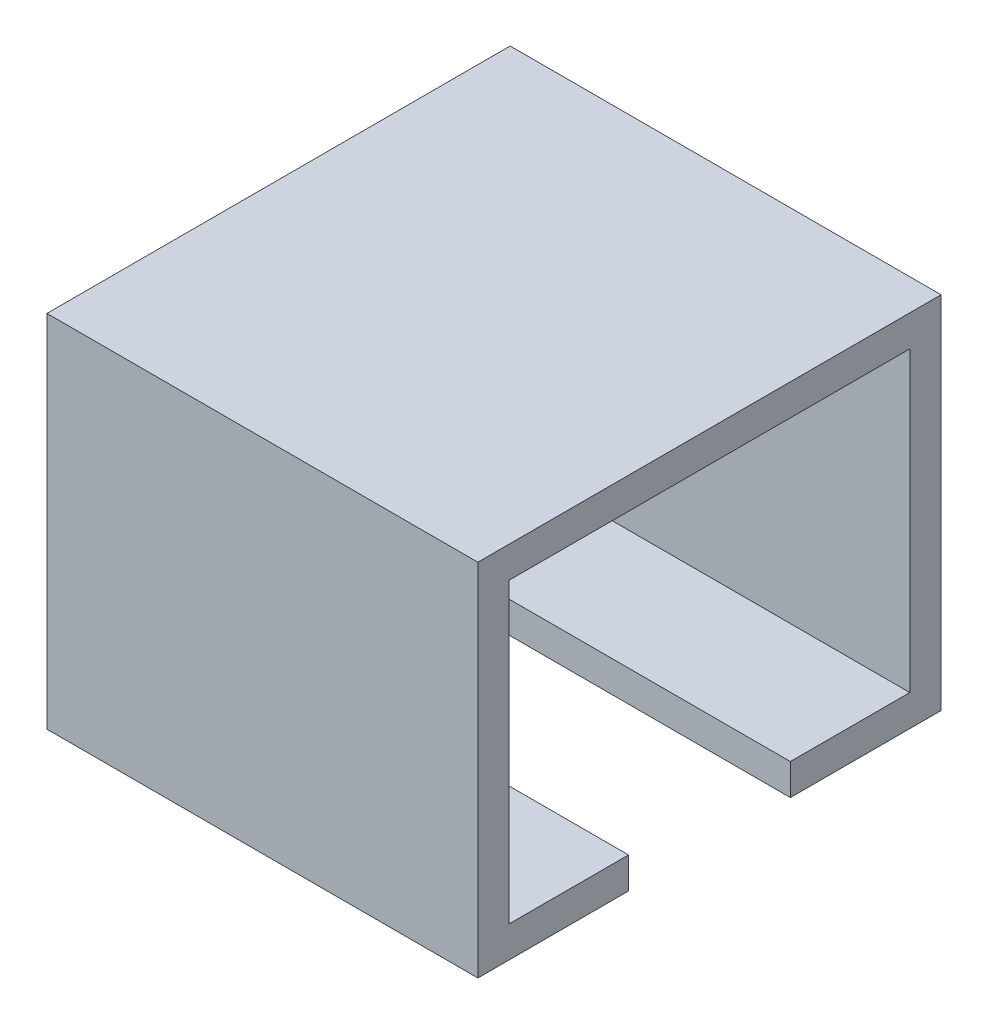
ISO-10303-21;
HEADER;
FILE_DESCRIPTION(('STEP AP214'),'2;1');
FILE_NAME('part.step','',(''),(''),'','','');
FILE_SCHEMA(('AUTOMOTIVE_DESIGN { 1 0 10303 214 1 1 1 1 }'));
ENDSEC;
DATA;
#1=APPLICATION_CONTEXT('core data for automotive mechanical design processes');
#2=APPLICATION_PROTOCOL_DEFINITION('international standard','automotive_design',2000,#1);
#3=PRODUCT_CONTEXT('',#1,'mechanical');
#4=PRODUCT('Part','Part','',(#3));
#5=PRODUCT_RELATED_PRODUCT_CATEGORY('part','',(#4));
#6=PRODUCT_DEFINITION_FORMATION('','',#4);
#7=PRODUCT_DEFINITION_CONTEXT('part definition',#1,'design');
#8=PRODUCT_DEFINITION('design','',#6,#7);
#9=PRODUCT_DEFINITION_SHAPE('','',#8);
#10=(LENGTH_UNIT() NAMED_UNIT(*) SI_UNIT(.MILLI.,.METRE.));
#11=(NAMED_UNIT(*) PLANE_ANGLE_UNIT() SI_UNIT($,.RADIAN.));
#12=(NAMED_UNIT(*) SI_UNIT($,.STERADIAN.) SOLID_ANGLE_UNIT());
#13=UNCERTAINTY_MEASURE_WITH_UNIT(LENGTH_MEASURE(1.E-05),#10,'distance_accuracy_value','');
#14=(GEOMETRIC_REPRESENTATION_CONTEXT(3) GLOBAL_UNCERTAINTY_ASSIGNED_CONTEXT((#13)) GLOBAL_UNIT_ASSIGNED_CONTEXT((#10,
#11,#12)) REPRESENTATION_CONTEXT('',''));
#15=CARTESIAN_POINT('',(0.,0.,0.));
#16=DIRECTION('',(0.,0.,1.));
#17=DIRECTION('',(1.,0.,0.));
#18=AXIS2_PLACEMENT_3D('',#15,#16,#17);
#19=CARTESIAN_POINT('',(0.0999999999998588,74.5297165423406,77.3109125997443));
#20=DIRECTION('',(1.,0.,0.));
#21=DIRECTION('',(0.,1.,0.));
#22=AXIS2_PLACEMENT_3D('',#19,#20,#21);
#23=PLANE('',#22);
#24=DIRECTION('',(0.,0.,-1.));
#25=VECTOR('',#24,1.);
#26=CARTESIAN_POINT('',(0.0999999999998588,74.2503165423406,81.0193125997443));
#27=LINE('',#26,#25);
#28=CARTESIAN_POINT('',(0.0999999999998588,74.2503165423406,81.0193125997443));
#29=VERTEX_POINT('',#28);
#30=CARTESIAN_POINT('',(0.099999999999861,74.2503165423406,73.6025125997444));
#31=VERTEX_POINT('',#30);
#32=EDGE_CURVE('E26',#29,#31,#27,.T.);
#33=ORIENTED_EDGE('',*,*,#32,.F.);
#34=DIRECTION('',(0.,-1.,0.));
#35=VECTOR('',#34,1.);
#36=CARTESIAN_POINT('',(0.0999999999998522,80.0161165423405,81.0193125997443));
#37=LINE('',#36,#35);
#38=CARTESIAN_POINT('',(0.0999999999998522,80.0161165423405,81.0193125997443));
#39=VERTEX_POINT('',#38);
#40=EDGE_CURVE('E158',#39,#29,#37,.T.);
#41=ORIENTED_EDGE('',*,*,#40,.F.);
#42=DIRECTION('',(0.,0.,1.));
#43=VECTOR('',#42,1.);
#44=CARTESIAN_POINT('',(0.0999999999998522,80.0161165423405,73.6025125997444));
#45=LINE('',#44,#43);
#46=CARTESIAN_POINT('',(0.0999999999998522,80.0161165423405,73.6025125997444));
#47=VERTEX_POINT('',#46);
#48=EDGE_CURVE('E285',#47,#39,#45,.T.);
#49=ORIENTED_EDGE('',*,*,#48,.F.);
#50=DIRECTION('',(0.,1.,0.));
#51=VECTOR('',#50,1.);
#52=CARTESIAN_POINT('',(0.099999999999861,74.2503165423406,73.6025125997444));
#53=LINE('',#52,#51);
#54=EDGE_CURVE('E278',#31,#47,#53,.T.);
#55=ORIENTED_EDGE('',*,*,#54,.F.);
#56=EDGE_LOOP('',(#33,#41,#49,#55));
#57=FACE_BOUND('',#56,.T.);
#58=ADVANCED_FACE('F16',(#57),#23,.F.);
#59=CARTESIAN_POINT('',(2.09999999999986,74.5297165423406,77.3109125997443));
#60=DIRECTION('',(1.,0.,0.));
#61=DIRECTION('',(0.,1.,0.));
#62=AXIS2_PLACEMENT_3D('',#59,#60,#61);
#63=PLANE('',#62);
#64=DIRECTION('',(0.,0.,-1.));
#65=VECTOR('',#64,1.);
#66=CARTESIAN_POINT('',(2.09999999999986,74.2503165423406,81.0193125997443));
#67=LINE('',#66,#65);
#68=CARTESIAN_POINT('',(2.09999999999986,74.2503165423406,78.6063125997443));
#69=VERTEX_POINT('',#68);
#70=CARTESIAN_POINT('',(2.09999999999986,74.2503165423406,76.0155125997443));
#71=VERTEX_POINT('',#70);
#72=EDGE_CURVE('E11',#69,#71,#67,.T.);
#73=ORIENTED_EDGE('',*,*,#72,.T.);
#74=DIRECTION('',(0.,1.,0.));
#75=VECTOR('',#74,1.);
#76=CARTESIAN_POINT('',(2.09999999999986,74.8091165423406,76.0155125997443));
#77=LINE('',#76,#75);
#78=CARTESIAN_POINT('',(2.09999999999986,74.7503165423406,76.0155125997443));
#79=VERTEX_POINT('',#78);
#80=EDGE_CURVE('E261',#71,#79,#77,.T.);
#81=ORIENTED_EDGE('',*,*,#80,.T.);
#82=DIRECTION('',(0.,1.,0.));
#83=VECTOR('',#82,1.);
#84=CARTESIAN_POINT('',(2.09999999999986,74.8091165423406,76.0155125997443));
#85=LINE('',#84,#83);
#86=CARTESIAN_POINT('',(2.09999999999986,74.8091165423406,76.0155125997443));
#87=VERTEX_POINT('',#86);
#88=EDGE_CURVE('E250',#79,#87,#85,.T.);
#89=ORIENTED_EDGE('',*,*,#88,.T.);
#90=DIRECTION('',(0.,0.,1.));
#91=VECTOR('',#90,1.);
#92=CARTESIAN_POINT('',(2.09999999999986,74.8091165423406,78.6063125997443));
#93=LINE('',#92,#91);
#94=CARTESIAN_POINT('',(2.09999999999986,74.8091165423406,78.6063125997443));
#95=VERTEX_POINT('',#94);
#96=EDGE_CURVE('E249',#87,#95,#93,.T.);
#97=ORIENTED_EDGE('',*,*,#96,.T.);
#98=DIRECTION('',(0.,-1.,0.));
#99=VECTOR('',#98,1.);
#100=CARTESIAN_POINT('',(2.09999999999986,74.2503165423406,78.6063125997443));
#101=LINE('',#100,#99);
#102=CARTESIAN_POINT('',(2.09999999999986,74.7503165423406,78.6063125997443));
#103=VERTEX_POINT('',#102);
#104=EDGE_CURVE('E39',#95,#103,#101,.T.);
#105=ORIENTED_EDGE('',*,*,#104,.T.);
#106=DIRECTION('',(0.,-1.,0.));
#107=VECTOR('',#106,1.);
#108=CARTESIAN_POINT('',(2.09999999999986,74.2503165423406,78.6063125997443));
#109=LINE('',#108,#107);
#110=EDGE_CURVE('E195',#103,#69,#109,.T.);
#111=ORIENTED_EDGE('',*,*,#110,.T.);
#112=EDGE_LOOP('',(#73,#81,#89,#97,#105,#111));
#113=FACE_BOUND('',#112,.T.);
#114=ADVANCED_FACE('F378',(#113),#63,.T.);
#115=CARTESIAN_POINT('',(0.099999999999861,74.2503165423406,78.6063125997443));
#116=DIRECTION('',(0.,-1.,0.));
#117=DIRECTION('',(0.,0.,-1.));
#118=AXIS2_PLACEMENT_3D('',#115,#116,#117);
#119=PLANE('',#118);
#120=ORIENTED_EDGE('',*,*,#32,.T.);
#121=DIRECTION('',(1.,0.,0.));
#122=VECTOR('',#121,1.);
#123=CARTESIAN_POINT('',(0.099999999999861,74.2503165423406,73.6025125997444));
#124=LINE('',#123,#122);
#125=CARTESIAN_POINT('',(6.99999999999986,74.2503165423406,73.6025125997444));
#126=VERTEX_POINT('',#125);
#127=EDGE_CURVE('E209',#31,#126,#124,.T.);
#128=ORIENTED_EDGE('',*,*,#127,.T.);
#129=DIRECTION('',(0.,0.,-1.));
#130=VECTOR('',#129,1.);
#131=CARTESIAN_POINT('',(6.99999999999986,74.2503165423406,81.0193125997443));
#132=LINE('',#131,#130);
#133=CARTESIAN_POINT('',(6.99999999999986,74.2503165423406,76.0155125997443));
#134=VERTEX_POINT('',#133);
#135=EDGE_CURVE('E205',#134,#126,#132,.T.);
#136=ORIENTED_EDGE('',*,*,#135,.F.);
#137=DIRECTION('',(-1.,0.,0.));
#138=VECTOR('',#137,1.);
#139=CARTESIAN_POINT('',(0.099999999999861,74.2503165423406,76.0155125997443));
#140=LINE('',#139,#138);
#141=EDGE_CURVE('E257',#134,#71,#140,.T.);
#142=ORIENTED_EDGE('',*,*,#141,.T.);
#143=ORIENTED_EDGE('',*,*,#72,.F.);
#144=DIRECTION('',(1.,0.,0.));
#145=VECTOR('',#144,1.);
#146=CARTESIAN_POINT('',(0.099999999999861,74.2503165423406,78.6063125997443));
#147=LINE('',#146,#145);
#148=CARTESIAN_POINT('',(6.99999999999986,74.2503165423406,78.6063125997443));
#149=VERTEX_POINT('',#148);
#150=EDGE_CURVE('E265',#69,#149,#147,.T.);
#151=ORIENTED_EDGE('',*,*,#150,.T.);
#152=DIRECTION('',(0.,0.,-1.));
#153=VECTOR('',#152,1.);
#154=CARTESIAN_POINT('',(6.99999999999986,74.2503165423406,81.0193125997443));
#155=LINE('',#154,#153);
#156=CARTESIAN_POINT('',(6.99999999999986,74.2503165423406,81.0193125997443));
#157=VERTEX_POINT('',#156);
#158=EDGE_CURVE('E208',#157,#149,#155,.T.);
#159=ORIENTED_EDGE('',*,*,#158,.F.);
#160=DIRECTION('',(1.,0.,0.));
#161=VECTOR('',#160,1.);
#162=CARTESIAN_POINT('',(0.0999999999998588,74.2503165423406,81.0193125997443));
#163=LINE('',#162,#161);
#164=EDGE_CURVE('E246',#29,#157,#163,.T.);
#165=ORIENTED_EDGE('',*,*,#164,.F.);
#166=EDGE_LOOP('',(#120,#128,#136,#142,#143,#151,#159,#165));
#167=FACE_BOUND('',#166,.T.);
#168=ADVANCED_FACE('F333',(#167),#119,.T.);
#169=CARTESIAN_POINT('',(0.0999999999998588,74.8091165423406,78.6063125997443));
#170=DIRECTION('',(0.,0.,1.));
#171=DIRECTION('',(0.,-1.,0.));
#172=AXIS2_PLACEMENT_3D('',#169,#170,#171);
#173=PLANE('',#172);
#174=DIRECTION('',(0.,-1.,0.));
#175=VECTOR('',#174,1.);
#176=CARTESIAN_POINT('',(0.999999999999857,75.9711665423406,78.6063125997443));
#177=LINE('',#176,#175);
#178=CARTESIAN_POINT('',(0.999999999999857,74.8091165423406,78.6063125997443));
#179=VERTEX_POINT('',#178);
#180=CARTESIAN_POINT('',(0.999999999999857,74.7503165423406,78.6063125997443));
#181=VERTEX_POINT('',#180);
#182=EDGE_CURVE('E238',#179,#181,#177,.T.);
#183=ORIENTED_EDGE('',*,*,#182,.T.);
#184=DIRECTION('',(1.,0.,0.));
#185=VECTOR('',#184,1.);
#186=CARTESIAN_POINT('',(3.54999999999986,74.7503165423406,78.6063125997443));
#187=LINE('',#186,#185);
#188=EDGE_CURVE('E201',#181,#103,#187,.T.);
#189=ORIENTED_EDGE('',*,*,#188,.T.);
#190=ORIENTED_EDGE('',*,*,#104,.F.);
#191=DIRECTION('',(1.,0.,0.));
#192=VECTOR('',#191,1.);
#193=CARTESIAN_POINT('',(0.0999999999998588,74.8091165423406,78.6063125997443));
#194=LINE('',#193,#192);
#195=EDGE_CURVE('E253',#179,#95,#194,.T.);
#196=ORIENTED_EDGE('',*,*,#195,.F.);
#197=EDGE_LOOP('',(#183,#189,#190,#196));
#198=FACE_BOUND('',#197,.T.);
#199=ADVANCED_FACE('F390',(#198),#173,.T.);
#200=CARTESIAN_POINT('',(0.0999999999998588,74.8091165423406,76.0155125997443));
#201=DIRECTION('',(0.,1.,0.));
#202=DIRECTION('',(1.,0.,0.));
#203=AXIS2_PLACEMENT_3D('',#200,#201,#202);
#204=PLANE('',#203);
#205=DIRECTION('',(0.,0.,1.));
#206=VECTOR('',#205,1.);
#207=CARTESIAN_POINT('',(0.999999999999857,74.8091165423406,76.6632125997444));
#208=LINE('',#207,#206);
#209=CARTESIAN_POINT('',(0.999999999999857,74.8091165423406,76.0155125997443));
#210=VERTEX_POINT('',#209);
#211=EDGE_CURVE('E234',#210,#179,#208,.T.);
#212=ORIENTED_EDGE('',*,*,#211,.T.);
#213=ORIENTED_EDGE('',*,*,#195,.T.);
#214=ORIENTED_EDGE('',*,*,#96,.F.);
#215=DIRECTION('',(1.,0.,0.));
#216=VECTOR('',#215,1.);
#217=CARTESIAN_POINT('',(0.0999999999998588,74.8091165423406,76.0155125997443));
#218=LINE('',#217,#216);
#219=EDGE_CURVE('E212',#210,#87,#218,.T.);
#220=ORIENTED_EDGE('',*,*,#219,.F.);
#221=EDGE_LOOP('',(#212,#213,#214,#220));
#222=FACE_BOUND('',#221,.T.);
#223=ADVANCED_FACE('F384',(#222),#204,.T.);
#224=CARTESIAN_POINT('',(0.099999999999861,74.2503165423406,76.0155125997443));
#225=DIRECTION('',(0.,0.,-1.));
#226=DIRECTION('',(0.,-1.,0.));
#227=AXIS2_PLACEMENT_3D('',#224,#225,#226);
#228=PLANE('',#227);
#229=DIRECTION('',(-1.,0.,0.));
#230=VECTOR('',#229,1.);
#231=CARTESIAN_POINT('',(3.54999999999986,74.7503165423406,76.0155125997443));
#232=LINE('',#231,#230);
#233=CARTESIAN_POINT('',(0.999999999999857,74.7503165423406,76.0155125997443));
#234=VERTEX_POINT('',#233);
#235=EDGE_CURVE('E215',#79,#234,#232,.T.);
#236=ORIENTED_EDGE('',*,*,#235,.T.);
#237=DIRECTION('',(0.,1.,0.));
#238=VECTOR('',#237,1.);
#239=CARTESIAN_POINT('',(0.999999999999857,75.6917665423406,76.0155125997443));
#240=LINE('',#239,#238);
#241=EDGE_CURVE('E200',#234,#210,#240,.T.);
#242=ORIENTED_EDGE('',*,*,#241,.T.);
#243=ORIENTED_EDGE('',*,*,#219,.T.);
#244=ORIENTED_EDGE('',*,*,#88,.F.);
#245=EDGE_LOOP('',(#236,#242,#243,#244));
#246=FACE_BOUND('',#245,.T.);
#247=ADVANCED_FACE('F389',(#246),#228,.T.);
#248=CARTESIAN_POINT('',(6.99999999999986,77.1332165423406,77.3109125997444));
#249=DIRECTION('',(1.,0.,0.));
#250=DIRECTION('',(0.,1.,0.));
#251=AXIS2_PLACEMENT_3D('',#248,#249,#250);
#252=PLANE('',#251);
#253=DIRECTION('',(0.,1.,0.));
#254=VECTOR('',#253,1.);
#255=CARTESIAN_POINT('',(6.99999999999986,75.9711665423406,78.6063125997443));
#256=LINE('',#255,#254);
#257=CARTESIAN_POINT('',(6.99999999999986,74.7503165423406,78.6063125997443));
#258=VERTEX_POINT('',#257);
#259=EDGE_CURVE('E194',#149,#258,#256,.T.);
#260=ORIENTED_EDGE('',*,*,#259,.T.);
#261=DIRECTION('',(0.,0.,1.));
#262=VECTOR('',#261,1.);
#263=CARTESIAN_POINT('',(6.99999999999986,74.7503165423406,75.7067125997444));
#264=LINE('',#263,#262);
#265=CARTESIAN_POINT('',(6.99999999999986,74.7503165423406,80.5193125997443));
#266=VERTEX_POINT('',#265);
#267=EDGE_CURVE('E159',#258,#266,#264,.T.);
#268=ORIENTED_EDGE('',*,*,#267,.T.);
#269=DIRECTION('',(0.,1.,0.));
#270=VECTOR('',#269,1.);
#271=CARTESIAN_POINT('',(6.99999999999986,75.9417665423406,80.5193125997443));
#272=LINE('',#271,#270);
#273=CARTESIAN_POINT('',(6.99999999999985,79.5161165423405,80.5193125997443));
#274=VERTEX_POINT('',#273);
#275=EDGE_CURVE('E169',#266,#274,#272,.T.);
#276=ORIENTED_EDGE('',*,*,#275,.T.);
#277=DIRECTION('',(0.,0.,-1.));
#278=VECTOR('',#277,1.);
#279=CARTESIAN_POINT('',(6.99999999999985,79.5161165423405,78.9151125997443));
#280=LINE('',#279,#278);
#281=CARTESIAN_POINT('',(6.99999999999985,79.5161165423405,74.1025125997445));
#282=VERTEX_POINT('',#281);
#283=EDGE_CURVE('E164',#274,#282,#280,.T.);
#284=ORIENTED_EDGE('',*,*,#283,.T.);
#285=DIRECTION('',(0.,-1.,0.));
#286=VECTOR('',#285,1.);
#287=CARTESIAN_POINT('',(6.99999999999985,78.3246665423405,74.1025125997445));
#288=LINE('',#287,#286);
#289=CARTESIAN_POINT('',(6.99999999999986,74.7503165423406,74.1025125997445));
#290=VERTEX_POINT('',#289);
#291=EDGE_CURVE('E147',#282,#290,#288,.T.);
#292=ORIENTED_EDGE('',*,*,#291,.T.);
#293=DIRECTION('',(0.,0.,1.));
#294=VECTOR('',#293,1.);
#295=CARTESIAN_POINT('',(6.99999999999986,74.7503165423406,75.7067125997444));
#296=LINE('',#295,#294);
#297=CARTESIAN_POINT('',(6.99999999999986,74.7503165423406,76.0155125997443));
#298=VERTEX_POINT('',#297);
#299=EDGE_CURVE('E184',#290,#298,#296,.T.);
#300=ORIENTED_EDGE('',*,*,#299,.T.);
#301=DIRECTION('',(0.,-1.,0.));
#302=VECTOR('',#301,1.);
#303=CARTESIAN_POINT('',(6.99999999999986,75.6917665423406,76.0155125997443));
#304=LINE('',#303,#302);
#305=EDGE_CURVE('E219',#298,#134,#304,.T.);
#306=ORIENTED_EDGE('',*,*,#305,.T.);
#307=ORIENTED_EDGE('',*,*,#135,.T.);
#308=DIRECTION('',(0.,1.,0.));
#309=VECTOR('',#308,1.);
#310=CARTESIAN_POINT('',(6.99999999999986,74.2503165423406,73.6025125997444));
#311=LINE('',#310,#309);
#312=CARTESIAN_POINT('',(6.99999999999985,80.0161165423405,73.6025125997444));
#313=VERTEX_POINT('',#312);
#314=EDGE_CURVE('E310',#126,#313,#311,.T.);
#315=ORIENTED_EDGE('',*,*,#314,.T.);
#316=DIRECTION('',(0.,0.,1.));
#317=VECTOR('',#316,1.);
#318=CARTESIAN_POINT('',(6.99999999999985,80.0161165423405,73.6025125997444));
#319=LINE('',#318,#317);
#320=CARTESIAN_POINT('',(6.99999999999985,80.0161165423405,81.0193125997443));
#321=VERTEX_POINT('',#320);
#322=EDGE_CURVE('E279',#313,#321,#319,.T.);
#323=ORIENTED_EDGE('',*,*,#322,.T.);
#324=DIRECTION('',(0.,-1.,0.));
#325=VECTOR('',#324,1.);
#326=CARTESIAN_POINT('',(6.99999999999985,80.0161165423405,81.0193125997443));
#327=LINE('',#326,#325);
#328=EDGE_CURVE('E288',#321,#157,#327,.T.);
#329=ORIENTED_EDGE('',*,*,#328,.T.);
#330=ORIENTED_EDGE('',*,*,#158,.T.);
#331=EDGE_LOOP('',(#260,#268,#276,#284,#292,#300,#306,#307,#315,#323,#329,#330));
#332=FACE_BOUND('',#331,.T.);
#333=ADVANCED_FACE('F173',(#332),#252,.T.);
#334=CARTESIAN_POINT('',(0.099999999999861,74.2503165423406,73.6025125997444));
#335=DIRECTION('',(0.,0.,-1.));
#336=DIRECTION('',(0.,-1.,0.));
#337=AXIS2_PLACEMENT_3D('',#334,#335,#336);
#338=PLANE('',#337);
#339=ORIENTED_EDGE('',*,*,#54,.T.);
#340=DIRECTION('',(1.,0.,0.));
#341=VECTOR('',#340,1.);
#342=CARTESIAN_POINT('',(0.0999999999998522,80.0161165423405,73.6025125997444));
#343=LINE('',#342,#341);
#344=EDGE_CURVE('E274',#47,#313,#343,.T.);
#345=ORIENTED_EDGE('',*,*,#344,.T.);
#346=ORIENTED_EDGE('',*,*,#314,.F.);
#347=ORIENTED_EDGE('',*,*,#127,.F.);
#348=EDGE_LOOP('',(#339,#345,#346,#347));
#349=FACE_BOUND('',#348,.T.);
#350=ADVANCED_FACE('F341',(#349),#338,.T.);
#351=CARTESIAN_POINT('',(0.0999999999998522,80.0161165423405,73.6025125997444));
#352=DIRECTION('',(0.,1.,0.));
#353=DIRECTION('',(1.,0.,0.));
#354=AXIS2_PLACEMENT_3D('',#351,#352,#353);
#355=PLANE('',#354);
#356=ORIENTED_EDGE('',*,*,#48,.T.);
#357=DIRECTION('',(1.,0.,0.));
#358=VECTOR('',#357,1.);
#359=CARTESIAN_POINT('',(0.0999999999998522,80.0161165423405,81.0193125997443));
#360=LINE('',#359,#358);
#361=EDGE_CURVE('E292',#39,#321,#360,.T.);
#362=ORIENTED_EDGE('',*,*,#361,.T.);
#363=ORIENTED_EDGE('',*,*,#322,.F.);
#364=ORIENTED_EDGE('',*,*,#344,.F.);
#365=EDGE_LOOP('',(#356,#362,#363,#364));
#366=FACE_BOUND('',#365,.T.);
#367=ADVANCED_FACE('F415',(#366),#355,.T.);
#368=CARTESIAN_POINT('',(0.0999999999998522,80.0161165423405,81.0193125997443));
#369=DIRECTION('',(0.,0.,1.));
#370=DIRECTION('',(0.,-1.,0.));
#371=AXIS2_PLACEMENT_3D('',#368,#369,#370);
#372=PLANE('',#371);
#373=ORIENTED_EDGE('',*,*,#40,.T.);
#374=ORIENTED_EDGE('',*,*,#164,.T.);
#375=ORIENTED_EDGE('',*,*,#328,.F.);
#376=ORIENTED_EDGE('',*,*,#361,.F.);
#377=EDGE_LOOP('',(#373,#374,#375,#376));
#378=FACE_BOUND('',#377,.T.);
#379=ADVANCED_FACE('F400',(#378),#372,.T.);
#380=CARTESIAN_POINT('',(6.99999999999985,79.5161165423405,74.1025125997445));
#381=DIRECTION('',(0.,0.,-1.));
#382=DIRECTION('',(0.,-1.,0.));
#383=AXIS2_PLACEMENT_3D('',#380,#381,#382);
#384=PLANE('',#383);
#385=ORIENTED_EDGE('',*,*,#291,.F.);
#386=DIRECTION('',(-1.,0.,0.));
#387=VECTOR('',#386,1.);
#388=CARTESIAN_POINT('',(6.99999999999985,79.5161165423405,74.1025125997445));
#389=LINE('',#388,#387);
#390=CARTESIAN_POINT('',(0.999999999999853,79.5161165423405,74.1025125997445));
#391=VERTEX_POINT('',#390);
#392=EDGE_CURVE('E151',#282,#391,#389,.T.);
#393=ORIENTED_EDGE('',*,*,#392,.T.);
#394=DIRECTION('',(0.,-1.,0.));
#395=VECTOR('',#394,1.);
#396=CARTESIAN_POINT('',(0.999999999999853,79.5161165423405,74.1025125997445));
#397=LINE('',#396,#395);
#398=CARTESIAN_POINT('',(0.99999999999986,74.7503165423406,74.1025125997445));
#399=VERTEX_POINT('',#398);
#400=EDGE_CURVE('E188',#391,#399,#397,.T.);
#401=ORIENTED_EDGE('',*,*,#400,.T.);
#402=DIRECTION('',(-1.,0.,0.));
#403=VECTOR('',#402,1.);
#404=CARTESIAN_POINT('',(6.99999999999986,74.7503165423406,74.1025125997445));
#405=LINE('',#404,#403);
#406=EDGE_CURVE('E153',#290,#399,#405,.T.);
#407=ORIENTED_EDGE('',*,*,#406,.F.);
#408=EDGE_LOOP('',(#385,#393,#401,#407));
#409=FACE_BOUND('',#408,.T.);
#410=ADVANCED_FACE('F149',(#409),#384,.F.);
#411=CARTESIAN_POINT('',(6.99999999999986,74.7503165423406,74.1025125997445));
#412=DIRECTION('',(0.,-1.,0.));
#413=DIRECTION('',(0.,0.,-1.));
#414=AXIS2_PLACEMENT_3D('',#411,#412,#413);
#415=PLANE('',#414);
#416=DIRECTION('',(-1.,0.,0.));
#417=VECTOR('',#416,1.);
#418=CARTESIAN_POINT('',(3.54999999999986,74.7503165423406,78.6063125997443));
#419=LINE('',#418,#417);
#420=EDGE_CURVE('E190',#258,#103,#419,.T.);
#421=ORIENTED_EDGE('',*,*,#420,.T.);
#422=ORIENTED_EDGE('',*,*,#188,.F.);
#423=DIRECTION('',(0.,0.,1.));
#424=VECTOR('',#423,1.);
#425=CARTESIAN_POINT('',(0.99999999999986,74.7503165423406,74.1025125997445));
#426=LINE('',#425,#424);
#427=CARTESIAN_POINT('',(0.999999999999857,74.7503165423406,80.5193125997443));
#428=VERTEX_POINT('',#427);
#429=EDGE_CURVE('E239',#181,#428,#426,.T.);
#430=ORIENTED_EDGE('',*,*,#429,.T.);
#431=DIRECTION('',(-1.,0.,0.));
#432=VECTOR('',#431,1.);
#433=CARTESIAN_POINT('',(6.99999999999986,74.7503165423406,80.5193125997443));
#434=LINE('',#433,#432);
#435=EDGE_CURVE('E203',#266,#428,#434,.T.);
#436=ORIENTED_EDGE('',*,*,#435,.F.);
#437=ORIENTED_EDGE('',*,*,#267,.F.);
#438=EDGE_LOOP('',(#421,#422,#430,#436,#437));
#439=FACE_BOUND('',#438,.T.);
#440=ADVANCED_FACE('F18',(#439),#415,.F.);
#441=CARTESIAN_POINT('',(6.99999999999986,74.7503165423406,80.5193125997443));
#442=DIRECTION('',(0.,0.,1.));
#443=DIRECTION('',(0.,-1.,0.));
#444=AXIS2_PLACEMENT_3D('',#441,#442,#443);
#445=PLANE('',#444);
#446=ORIENTED_EDGE('',*,*,#275,.F.);
#447=ORIENTED_EDGE('',*,*,#435,.T.);
#448=DIRECTION('',(0.,1.,0.));
#449=VECTOR('',#448,1.);
#450=CARTESIAN_POINT('',(0.999999999999857,74.7503165423406,80.5193125997443));
#451=LINE('',#450,#449);
#452=CARTESIAN_POINT('',(0.999999999999853,79.5161165423405,80.5193125997443));
#453=VERTEX_POINT('',#452);
#454=EDGE_CURVE('E242',#428,#453,#451,.T.);
#455=ORIENTED_EDGE('',*,*,#454,.T.);
#456=DIRECTION('',(-1.,0.,0.));
#457=VECTOR('',#456,1.);
#458=CARTESIAN_POINT('',(6.99999999999985,79.5161165423405,80.5193125997443));
#459=LINE('',#458,#457);
#460=EDGE_CURVE('E170',#274,#453,#459,.T.);
#461=ORIENTED_EDGE('',*,*,#460,.F.);
#462=EDGE_LOOP('',(#446,#447,#455,#461));
#463=FACE_BOUND('',#462,.T.);
#464=ADVANCED_FACE('F356',(#463),#445,.F.);
#465=CARTESIAN_POINT('',(6.99999999999985,79.5161165423405,80.5193125997443));
#466=DIRECTION('',(0.,1.,0.));
#467=DIRECTION('',(1.,0.,0.));
#468=AXIS2_PLACEMENT_3D('',#465,#466,#467);
#469=PLANE('',#468);
#470=ORIENTED_EDGE('',*,*,#283,.F.);
#471=ORIENTED_EDGE('',*,*,#460,.T.);
#472=DIRECTION('',(0.,0.,-1.));
#473=VECTOR('',#472,1.);
#474=CARTESIAN_POINT('',(0.999999999999853,79.5161165423405,80.5193125997443));
#475=LINE('',#474,#473);
#476=EDGE_CURVE('E166',#453,#391,#475,.T.);
#477=ORIENTED_EDGE('',*,*,#476,.T.);
#478=ORIENTED_EDGE('',*,*,#392,.F.);
#479=EDGE_LOOP('',(#470,#471,#477,#478));
#480=FACE_BOUND('',#479,.T.);
#481=ADVANCED_FACE('F163',(#480),#469,.F.);
#482=CARTESIAN_POINT('',(6.99999999999986,74.7503165423406,74.1025125997445));
#483=DIRECTION('',(0.,-1.,0.));
#484=DIRECTION('',(0.,0.,-1.));
#485=AXIS2_PLACEMENT_3D('',#482,#483,#484);
#486=PLANE('',#485);
#487=ORIENTED_EDGE('',*,*,#235,.F.);
#488=DIRECTION('',(1.,0.,0.));
#489=VECTOR('',#488,1.);
#490=CARTESIAN_POINT('',(3.54999999999986,74.7503165423406,76.0155125997443));
#491=LINE('',#490,#489);
#492=EDGE_CURVE('E216',#79,#298,#491,.T.);
#493=ORIENTED_EDGE('',*,*,#492,.T.);
#494=ORIENTED_EDGE('',*,*,#299,.F.);
#495=ORIENTED_EDGE('',*,*,#406,.T.);
#496=DIRECTION('',(0.,0.,1.));
#497=VECTOR('',#496,1.);
#498=CARTESIAN_POINT('',(0.99999999999986,74.7503165423406,74.1025125997445));
#499=LINE('',#498,#497);
#500=EDGE_CURVE('E196',#399,#234,#499,.T.);
#501=ORIENTED_EDGE('',*,*,#500,.T.);
#502=EDGE_LOOP('',(#487,#493,#494,#495,#501));
#503=FACE_BOUND('',#502,.T.);
#504=ADVANCED_FACE('F368',(#503),#486,.F.);
#505=CARTESIAN_POINT('',(0.999999999999855,77.1332165423406,77.3109125997444));
#506=DIRECTION('',(-1.,0.,0.));
#507=DIRECTION('',(0.,1.,0.));
#508=AXIS2_PLACEMENT_3D('',#505,#506,#507);
#509=PLANE('',#508);
#510=ORIENTED_EDGE('',*,*,#182,.F.);
#511=ORIENTED_EDGE('',*,*,#211,.F.);
#512=ORIENTED_EDGE('',*,*,#241,.F.);
#513=ORIENTED_EDGE('',*,*,#500,.F.);
#514=ORIENTED_EDGE('',*,*,#400,.F.);
#515=ORIENTED_EDGE('',*,*,#476,.F.);
#516=ORIENTED_EDGE('',*,*,#454,.F.);
#517=ORIENTED_EDGE('',*,*,#429,.F.);
#518=EDGE_LOOP('',(#510,#511,#512,#513,#514,#515,#516,#517));
#519=FACE_BOUND('',#518,.T.);
#520=ADVANCED_FACE('F362',(#519),#509,.F.);
#521=CARTESIAN_POINT('',(0.0999999999998588,74.8091165423406,78.6063125997443));
#522=DIRECTION('',(0.,0.,1.));
#523=DIRECTION('',(0.,-1.,0.));
#524=AXIS2_PLACEMENT_3D('',#521,#522,#523);
#525=PLANE('',#524);
#526=ORIENTED_EDGE('',*,*,#110,.F.);
#527=ORIENTED_EDGE('',*,*,#420,.F.);
#528=ORIENTED_EDGE('',*,*,#259,.F.);
#529=ORIENTED_EDGE('',*,*,#150,.F.);
#530=EDGE_LOOP('',(#526,#527,#528,#529));
#531=FACE_BOUND('',#530,.T.);
#532=ADVANCED_FACE('F367',(#531),#525,.F.);
#533=CARTESIAN_POINT('',(0.099999999999861,74.2503165423406,76.0155125997443));
#534=DIRECTION('',(0.,0.,-1.));
#535=DIRECTION('',(0.,-1.,0.));
#536=AXIS2_PLACEMENT_3D('',#533,#534,#535);
#537=PLANE('',#536);
#538=ORIENTED_EDGE('',*,*,#80,.F.);
#539=ORIENTED_EDGE('',*,*,#141,.F.);
#540=ORIENTED_EDGE('',*,*,#305,.F.);
#541=ORIENTED_EDGE('',*,*,#492,.F.);
#542=EDGE_LOOP('',(#538,#539,#540,#541));
#543=FACE_BOUND('',#542,.T.);
#544=ADVANCED_FACE('F331',(#543),#537,.F.);
#545=CLOSED_SHELL('',(#58,#114,#168,#199,#223,#247,#333,#350,#367,#379,#410,#440,#464,#481,#504,
#520,#532,#544));
#546=MANIFOLD_SOLID_BREP('B1',#545);
#547=ADVANCED_BREP_SHAPE_REPRESENTATION('',(#18,#546),#14);
#548=SHAPE_DEFINITION_REPRESENTATION(#9,#547);
ENDSEC;
END-ISO-10303-21;
